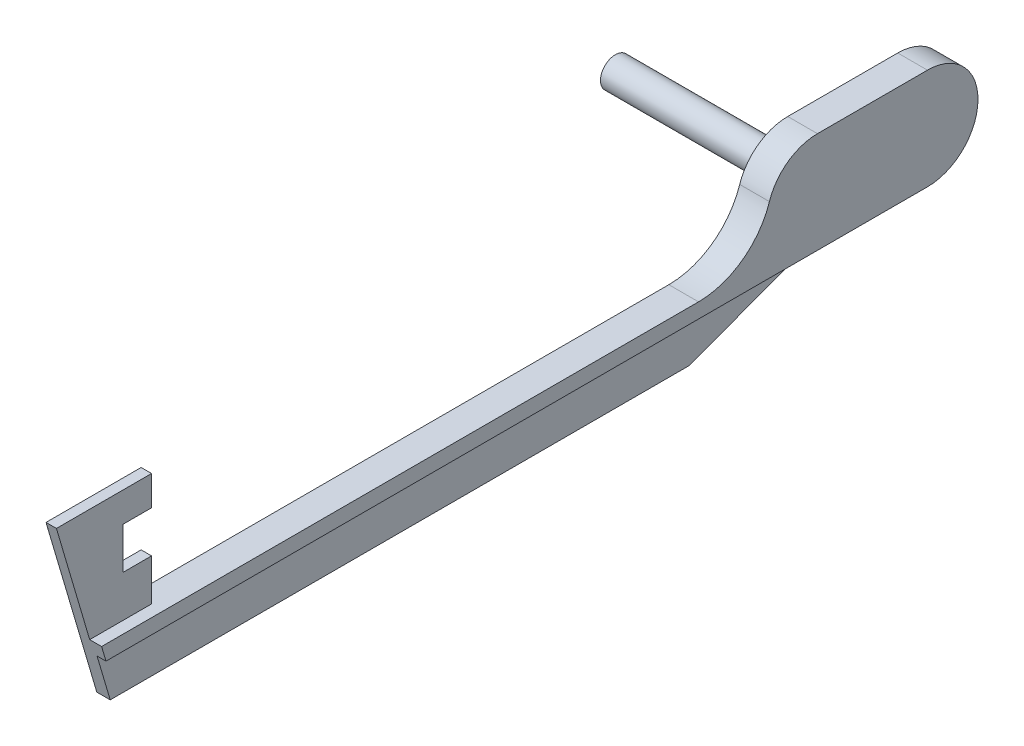
ISO-10303-21;
HEADER;
FILE_DESCRIPTION(('STEP AP214'),'2;1');
FILE_NAME('part.step','',(''),(''),'','','');
FILE_SCHEMA(('AUTOMOTIVE_DESIGN { 1 0 10303 214 1 1 1 1 }'));
ENDSEC;
DATA;
#1=APPLICATION_CONTEXT('core data for automotive mechanical design processes');
#2=APPLICATION_PROTOCOL_DEFINITION('international standard','automotive_design',2000,#1);
#3=PRODUCT_CONTEXT('',#1,'mechanical');
#4=PRODUCT('Part','Part','',(#3));
#5=PRODUCT_RELATED_PRODUCT_CATEGORY('part','',(#4));
#6=PRODUCT_DEFINITION_FORMATION('','',#4);
#7=PRODUCT_DEFINITION_CONTEXT('part definition',#1,'design');
#8=PRODUCT_DEFINITION('design','',#6,#7);
#9=PRODUCT_DEFINITION_SHAPE('','',#8);
#10=(LENGTH_UNIT() NAMED_UNIT(*) SI_UNIT(.MILLI.,.METRE.));
#11=(NAMED_UNIT(*) PLANE_ANGLE_UNIT() SI_UNIT($,.RADIAN.));
#12=(NAMED_UNIT(*) SI_UNIT($,.STERADIAN.) SOLID_ANGLE_UNIT());
#13=UNCERTAINTY_MEASURE_WITH_UNIT(LENGTH_MEASURE(1.E-05),#10,'distance_accuracy_value','');
#14=(GEOMETRIC_REPRESENTATION_CONTEXT(3) GLOBAL_UNCERTAINTY_ASSIGNED_CONTEXT((#13)) GLOBAL_UNIT_ASSIGNED_CONTEXT((#10,
#11,#12)) REPRESENTATION_CONTEXT('',''));
#15=CARTESIAN_POINT('',(0.,0.,0.));
#16=DIRECTION('',(0.,0.,1.));
#17=DIRECTION('',(1.,0.,0.));
#18=AXIS2_PLACEMENT_3D('',#15,#16,#17);
#19=CARTESIAN_POINT('',(2.54,-3.048,0.));
#20=DIRECTION('',(0.,-1.,0.));
#21=DIRECTION('',(0.,0.,-1.));
#22=AXIS2_PLACEMENT_3D('',#19,#20,#21);
#23=PLANE('',#22);
#24=DIRECTION('',(0.,0.,1.));
#25=VECTOR('',#24,1.);
#26=CARTESIAN_POINT('',(0.,-3.048,0.));
#27=LINE('',#26,#25);
#28=CARTESIAN_POINT('',(0.,-3.048,19.558));
#29=VERTEX_POINT('',#28);
#30=CARTESIAN_POINT('',(0.,-3.048,64.6744712471544));
#31=VERTEX_POINT('',#30);
#32=EDGE_CURVE('E269',#29,#31,#27,.T.);
#33=ORIENTED_EDGE('',*,*,#32,.T.);
#34=DIRECTION('',(1.,0.,0.));
#35=VECTOR('',#34,1.);
#36=CARTESIAN_POINT('',(2.54,-3.048,64.6744712471544));
#37=LINE('',#36,#35);
#38=CARTESIAN_POINT('',(0.634140793696349,-3.048,64.6744712471544));
#39=VERTEX_POINT('',#38);
#40=EDGE_CURVE('E209',#31,#39,#37,.T.);
#41=ORIENTED_EDGE('',*,*,#40,.T.);
#42=DIRECTION('',(0.,0.,1.));
#43=VECTOR('',#42,1.);
#44=CARTESIAN_POINT('',(0.634140793696337,-3.048,0.));
#45=LINE('',#44,#43);
#46=CARTESIAN_POINT('',(0.634140793696349,-3.048,65.278));
#47=VERTEX_POINT('',#46);
#48=EDGE_CURVE('E172',#39,#47,#45,.T.);
#49=ORIENTED_EDGE('',*,*,#48,.T.);
#50=DIRECTION('',(1.,0.,0.));
#51=VECTOR('',#50,1.);
#52=CARTESIAN_POINT('',(0.254,-3.048,65.278));
#53=LINE('',#52,#51);
#54=CARTESIAN_POINT('',(1.524,-3.048,65.278));
#55=VERTEX_POINT('',#54);
#56=EDGE_CURVE('E231',#47,#55,#53,.T.);
#57=ORIENTED_EDGE('',*,*,#56,.T.);
#58=DIRECTION('',(0.,0.,1.));
#59=VECTOR('',#58,1.);
#60=CARTESIAN_POINT('',(1.524,-3.048,0.));
#61=LINE('',#60,#59);
#62=CARTESIAN_POINT('',(1.524,-3.048,70.5615860198938));
#63=VERTEX_POINT('',#62);
#64=EDGE_CURVE('E211',#55,#63,#61,.T.);
#65=ORIENTED_EDGE('',*,*,#64,.T.);
#66=DIRECTION('',(-1.,0.,0.));
#67=VECTOR('',#66,1.);
#68=CARTESIAN_POINT('',(2.54,-3.048,70.5615860198938));
#69=LINE('',#68,#67);
#70=CARTESIAN_POINT('',(2.54,-3.048,70.5615860198938));
#71=VERTEX_POINT('',#70);
#72=EDGE_CURVE('E282',#71,#63,#69,.T.);
#73=ORIENTED_EDGE('',*,*,#72,.F.);
#74=DIRECTION('',(0.,0.,1.));
#75=VECTOR('',#74,1.);
#76=CARTESIAN_POINT('',(2.54,-3.048,0.));
#77=LINE('',#76,#75);
#78=CARTESIAN_POINT('',(2.54,-3.048,19.558));
#79=VERTEX_POINT('',#78);
#80=EDGE_CURVE('E280',#79,#71,#77,.T.);
#81=ORIENTED_EDGE('',*,*,#80,.F.);
#82=DIRECTION('',(-1.,0.,0.));
#83=VECTOR('',#82,1.);
#84=CARTESIAN_POINT('',(2.54,-3.048,19.558));
#85=LINE('',#84,#83);
#86=EDGE_CURVE('E297',#79,#29,#85,.T.);
#87=ORIENTED_EDGE('',*,*,#86,.T.);
#88=EDGE_LOOP('',(#33,#41,#49,#57,#65,#73,#81,#87));
#89=FACE_BOUND('',#88,.T.);
#90=ADVANCED_FACE('F35',(#89),#23,.F.);
#91=CARTESIAN_POINT('',(2.54,-19.3762316155653,65.7497076239421));
#92=DIRECTION('',(0.,0.282677628483706,-0.959214969834618));
#93=DIRECTION('',(0.,0.959214969834619,0.282677628483706));
#94=AXIS2_PLACEMENT_3D('',#91,#92,#93);
#95=PLANE('',#94);
#96=DIRECTION('',(1.,0.,0.));
#97=VECTOR('',#96,1.);
#98=CARTESIAN_POINT('',(0.254,6.604,73.406));
#99=LINE('',#98,#97);
#100=CARTESIAN_POINT('',(0.63414079369635,6.604,73.406));
#101=VERTEX_POINT('',#100);
#102=CARTESIAN_POINT('',(1.524,6.604,73.406));
#103=VERTEX_POINT('',#102);
#104=EDGE_CURVE('E232',#101,#103,#99,.T.);
#105=ORIENTED_EDGE('',*,*,#104,.F.);
#106=DIRECTION('',(0.,-0.959214969834619,-0.282677628483706));
#107=VECTOR('',#106,1.);
#108=CARTESIAN_POINT('',(0.634140793696349,-19.3762316155653,65.7497076239421));
#109=LINE('',#108,#107);
#110=CARTESIAN_POINT('',(0.634140793696349,-8.12800000000002,69.0645260303642));
#111=VERTEX_POINT('',#110);
#112=EDGE_CURVE('E207',#101,#111,#109,.T.);
#113=ORIENTED_EDGE('',*,*,#112,.T.);
#114=DIRECTION('',(-1.,0.,0.));
#115=VECTOR('',#114,1.);
#116=CARTESIAN_POINT('',(1.778,-8.128,69.0645260303642));
#117=LINE('',#116,#115);
#118=CARTESIAN_POINT('',(1.778,-8.128,69.0645260303642));
#119=VERTEX_POINT('',#118);
#120=EDGE_CURVE('E189',#119,#111,#117,.T.);
#121=ORIENTED_EDGE('',*,*,#120,.F.);
#122=DIRECTION('',(0.,-0.959214969834618,-0.282677628483706));
#123=VECTOR('',#122,1.);
#124=CARTESIAN_POINT('',(1.778,-19.3762316155653,65.7497076239421));
#125=LINE('',#124,#123);
#126=CARTESIAN_POINT('',(1.778,-4.318,70.1873210225114));
#127=VERTEX_POINT('',#126);
#128=EDGE_CURVE('E252',#127,#119,#125,.T.);
#129=ORIENTED_EDGE('',*,*,#128,.F.);
#130=DIRECTION('',(-1.,0.,0.));
#131=VECTOR('',#130,1.);
#132=CARTESIAN_POINT('',(2.54,-4.318,70.1873210225114));
#133=LINE('',#132,#131);
#134=CARTESIAN_POINT('',(2.54,-4.318,70.1873210225114));
#135=VERTEX_POINT('',#134);
#136=EDGE_CURVE('E43',#135,#127,#133,.T.);
#137=ORIENTED_EDGE('',*,*,#136,.F.);
#138=DIRECTION('',(0.,-0.959214969834618,-0.282677628483706));
#139=VECTOR('',#138,1.);
#140=CARTESIAN_POINT('',(2.54,-19.3762316155653,65.7497076239421));
#141=LINE('',#140,#139);
#142=EDGE_CURVE('E266',#71,#135,#141,.T.);
#143=ORIENTED_EDGE('',*,*,#142,.F.);
#144=ORIENTED_EDGE('',*,*,#72,.T.);
#145=DIRECTION('',(0.,-0.959214969834618,-0.282677628483706));
#146=VECTOR('',#145,1.);
#147=CARTESIAN_POINT('',(1.524,-19.3762316155653,65.7497076239421));
#148=LINE('',#147,#146);
#149=EDGE_CURVE('E57',#103,#63,#148,.T.);
#150=ORIENTED_EDGE('',*,*,#149,.F.);
#151=EDGE_LOOP('',(#105,#113,#121,#129,#137,#143,#144,#150));
#152=FACE_BOUND('',#151,.T.);
#153=ADVANCED_FACE('F37',(#152),#95,.F.);
#154=CARTESIAN_POINT('',(2.54,-4.318,0.));
#155=DIRECTION('',(0.,-1.,0.));
#156=DIRECTION('',(0.,0.,-1.));
#157=AXIS2_PLACEMENT_3D('',#154,#155,#156);
#158=PLANE('',#157);
#159=DIRECTION('',(-1.,0.,0.));
#160=VECTOR('',#159,1.);
#161=CARTESIAN_POINT('',(1.778,-4.318,9.398));
#162=LINE('',#161,#160);
#163=CARTESIAN_POINT('',(1.778,-4.318,9.398));
#164=VERTEX_POINT('',#163);
#165=CARTESIAN_POINT('',(0.,-4.318,9.398));
#166=VERTEX_POINT('',#165);
#167=EDGE_CURVE('E262',#164,#166,#162,.T.);
#168=ORIENTED_EDGE('',*,*,#167,.T.);
#169=DIRECTION('',(0.,0.,1.));
#170=VECTOR('',#169,1.);
#171=CARTESIAN_POINT('',(0.,-4.318,0.));
#172=LINE('',#171,#170);
#173=CARTESIAN_POINT('',(0.,-4.318,0.));
#174=VERTEX_POINT('',#173);
#175=EDGE_CURVE('E265',#174,#166,#172,.T.);
#176=ORIENTED_EDGE('',*,*,#175,.F.);
#177=DIRECTION('',(-1.,0.,0.));
#178=VECTOR('',#177,1.);
#179=CARTESIAN_POINT('',(2.54,-4.318,0.));
#180=LINE('',#179,#178);
#181=CARTESIAN_POINT('',(2.54,-4.318,0.));
#182=VERTEX_POINT('',#181);
#183=EDGE_CURVE('E309',#182,#174,#180,.T.);
#184=ORIENTED_EDGE('',*,*,#183,.F.);
#185=DIRECTION('',(0.,0.,1.));
#186=VECTOR('',#185,1.);
#187=CARTESIAN_POINT('',(2.54,-4.318,0.));
#188=LINE('',#187,#186);
#189=EDGE_CURVE('E268',#182,#135,#188,.T.);
#190=ORIENTED_EDGE('',*,*,#189,.T.);
#191=ORIENTED_EDGE('',*,*,#136,.T.);
#192=DIRECTION('',(0.,0.,1.));
#193=VECTOR('',#192,1.);
#194=CARTESIAN_POINT('',(1.778,-4.318,0.));
#195=LINE('',#194,#193);
#196=EDGE_CURVE('E249',#164,#127,#195,.T.);
#197=ORIENTED_EDGE('',*,*,#196,.F.);
#198=EDGE_LOOP('',(#168,#176,#184,#190,#191,#197));
#199=FACE_BOUND('',#198,.T.);
#200=ADVANCED_FACE('F314',(#199),#158,.T.);
#201=CARTESIAN_POINT('',(2.54,0.,0.));
#202=DIRECTION('',(-1.,0.,0.));
#203=DIRECTION('',(0.,0.,1.));
#204=AXIS2_PLACEMENT_3D('',#201,#202,#203);
#205=CYLINDRICAL_SURFACE('',#204,4.318);
#206=CARTESIAN_POINT('',(0.,0.,0.));
#207=DIRECTION('',(1.,0.,0.));
#208=DIRECTION('',(0.,0.,-1.));
#209=AXIS2_PLACEMENT_3D('',#206,#207,#208);
#210=CIRCLE('',#209,4.318);
#211=CARTESIAN_POINT('',(0.,4.318,0.));
#212=VERTEX_POINT('',#211);
#213=EDGE_CURVE('E285',#174,#212,#210,.T.);
#214=ORIENTED_EDGE('',*,*,#213,.T.);
#215=DIRECTION('',(-1.,0.,0.));
#216=VECTOR('',#215,1.);
#217=CARTESIAN_POINT('',(2.54,4.318,0.));
#218=LINE('',#217,#216);
#219=CARTESIAN_POINT('',(2.54,4.318,0.));
#220=VERTEX_POINT('',#219);
#221=EDGE_CURVE('E306',#220,#212,#218,.T.);
#222=ORIENTED_EDGE('',*,*,#221,.F.);
#223=CARTESIAN_POINT('',(2.54,0.,0.));
#224=DIRECTION('',(1.,0.,0.));
#225=DIRECTION('',(0.,0.,-1.));
#226=AXIS2_PLACEMENT_3D('',#223,#224,#225);
#227=CIRCLE('',#226,4.318);
#228=EDGE_CURVE('E272',#182,#220,#227,.T.);
#229=ORIENTED_EDGE('',*,*,#228,.F.);
#230=ORIENTED_EDGE('',*,*,#183,.T.);
#231=EDGE_LOOP('',(#214,#222,#229,#230));
#232=FACE_BOUND('',#231,.T.);
#233=ADVANCED_FACE('F334',(#232),#205,.T.);
#234=CARTESIAN_POINT('',(2.54,4.318,0.));
#235=DIRECTION('',(0.,-1.,0.));
#236=DIRECTION('',(0.,0.,-1.));
#237=AXIS2_PLACEMENT_3D('',#234,#235,#236);
#238=PLANE('',#237);
#239=DIRECTION('',(0.,0.,1.));
#240=VECTOR('',#239,1.);
#241=CARTESIAN_POINT('',(0.,4.318,0.));
#242=LINE('',#241,#240);
#243=CARTESIAN_POINT('',(0.,4.318,9.398));
#244=VERTEX_POINT('',#243);
#245=EDGE_CURVE('E287',#212,#244,#242,.T.);
#246=ORIENTED_EDGE('',*,*,#245,.T.);
#247=DIRECTION('',(-1.,0.,0.));
#248=VECTOR('',#247,1.);
#249=CARTESIAN_POINT('',(2.54,4.318,9.398));
#250=LINE('',#249,#248);
#251=CARTESIAN_POINT('',(2.54,4.318,9.398));
#252=VERTEX_POINT('',#251);
#253=EDGE_CURVE('E303',#252,#244,#250,.T.);
#254=ORIENTED_EDGE('',*,*,#253,.F.);
#255=DIRECTION('',(0.,0.,1.));
#256=VECTOR('',#255,1.);
#257=CARTESIAN_POINT('',(2.54,4.318,0.));
#258=LINE('',#257,#256);
#259=EDGE_CURVE('E274',#220,#252,#258,.T.);
#260=ORIENTED_EDGE('',*,*,#259,.F.);
#261=ORIENTED_EDGE('',*,*,#221,.T.);
#262=EDGE_LOOP('',(#246,#254,#260,#261));
#263=FACE_BOUND('',#262,.T.);
#264=ADVANCED_FACE('F338',(#263),#238,.F.);
#265=CARTESIAN_POINT('',(2.54,0.,9.398));
#266=DIRECTION('',(-1.,0.,0.));
#267=DIRECTION('',(0.,0.,1.));
#268=AXIS2_PLACEMENT_3D('',#265,#266,#267);
#269=CYLINDRICAL_SURFACE('',#268,4.318);
#270=CARTESIAN_POINT('',(0.,0.,9.398));
#271=DIRECTION('',(1.,0.,0.));
#272=DIRECTION('',(0.,0.,-1.));
#273=AXIS2_PLACEMENT_3D('',#270,#271,#272);
#274=CIRCLE('',#273,4.318);
#275=CARTESIAN_POINT('',(0.,1.34263088897993,13.5019573945104));
#276=VERTEX_POINT('',#275);
#277=EDGE_CURVE('E289',#244,#276,#274,.T.);
#278=ORIENTED_EDGE('',*,*,#277,.T.);
#279=DIRECTION('',(-1.,0.,0.));
#280=VECTOR('',#279,1.);
#281=CARTESIAN_POINT('',(2.54,1.34263088897993,13.5019573945104));
#282=LINE('',#281,#280);
#283=CARTESIAN_POINT('',(2.54,1.34263088897993,13.5019573945104));
#284=VERTEX_POINT('',#283);
#285=EDGE_CURVE('E300',#284,#276,#282,.T.);
#286=ORIENTED_EDGE('',*,*,#285,.F.);
#287=CARTESIAN_POINT('',(2.54,0.,9.398));
#288=DIRECTION('',(1.,0.,0.));
#289=DIRECTION('',(0.,0.,-1.));
#290=AXIS2_PLACEMENT_3D('',#287,#288,#289);
#291=CIRCLE('',#290,4.318);
#292=EDGE_CURVE('E276',#252,#284,#291,.T.);
#293=ORIENTED_EDGE('',*,*,#292,.F.);
#294=ORIENTED_EDGE('',*,*,#253,.T.);
#295=EDGE_LOOP('',(#278,#286,#293,#294));
#296=FACE_BOUND('',#295,.T.);
#297=ADVANCED_FACE('F383',(#296),#269,.T.);
#298=CARTESIAN_POINT('',(2.54,3.32389655172413,19.558));
#299=DIRECTION('',(-1.,0.,0.));
#300=DIRECTION('',(0.,0.,1.));
#301=AXIS2_PLACEMENT_3D('',#298,#299,#300);
#302=CYLINDRICAL_SURFACE('',#301,6.37189655172413);
#303=CARTESIAN_POINT('',(0.,3.32389655172413,19.558));
#304=DIRECTION('',(1.,0.,0.));
#305=DIRECTION('',(0.,0.,-1.));
#306=AXIS2_PLACEMENT_3D('',#303,#304,#305);
#307=CIRCLE('',#306,6.37189655172413);
#308=EDGE_CURVE('E291',#276,#29,#307,.F.);
#309=ORIENTED_EDGE('',*,*,#308,.T.);
#310=ORIENTED_EDGE('',*,*,#86,.F.);
#311=CARTESIAN_POINT('',(2.54,3.32389655172413,19.558));
#312=DIRECTION('',(1.,0.,0.));
#313=DIRECTION('',(0.,0.,-1.));
#314=AXIS2_PLACEMENT_3D('',#311,#312,#313);
#315=CIRCLE('',#314,6.37189655172413);
#316=EDGE_CURVE('E278',#284,#79,#315,.F.);
#317=ORIENTED_EDGE('',*,*,#316,.F.);
#318=ORIENTED_EDGE('',*,*,#285,.T.);
#319=EDGE_LOOP('',(#309,#310,#317,#318));
#320=FACE_BOUND('',#319,.T.);
#321=ADVANCED_FACE('F381',(#320),#302,.F.);
#322=CARTESIAN_POINT('',(2.54,0.,0.));
#323=DIRECTION('',(1.,0.,0.));
#324=DIRECTION('',(0.,0.,-1.));
#325=AXIS2_PLACEMENT_3D('',#322,#323,#324);
#326=PLANE('',#325);
#327=ORIENTED_EDGE('',*,*,#142,.T.);
#328=ORIENTED_EDGE('',*,*,#189,.F.);
#329=ORIENTED_EDGE('',*,*,#228,.T.);
#330=ORIENTED_EDGE('',*,*,#259,.T.);
#331=ORIENTED_EDGE('',*,*,#292,.T.);
#332=ORIENTED_EDGE('',*,*,#316,.T.);
#333=ORIENTED_EDGE('',*,*,#80,.T.);
#334=EDGE_LOOP('',(#327,#328,#329,#330,#331,#332,#333));
#335=FACE_BOUND('',#334,.T.);
#336=ADVANCED_FACE('F342',(#335),#326,.T.);
#337=CARTESIAN_POINT('',(0.,0.,0.));
#338=DIRECTION('',(1.,0.,0.));
#339=DIRECTION('',(0.,0.,-1.));
#340=AXIS2_PLACEMENT_3D('',#337,#338,#339);
#341=PLANE('',#340);
#342=CARTESIAN_POINT('',(0.,0.,9.144));
#343=DIRECTION('',(1.,0.,0.));
#344=DIRECTION('',(0.,0.,-1.));
#345=AXIS2_PLACEMENT_3D('',#342,#343,#344);
#346=CIRCLE('',#345,1.27);
#347=CARTESIAN_POINT('',(0.,0.,7.874));
#348=VERTEX_POINT('',#347);
#349=EDGE_CURVE('E195',#348,#348,#346,.T.);
#350=ORIENTED_EDGE('',*,*,#349,.T.);
#351=EDGE_LOOP('',(#350));
#352=FACE_BOUND('',#351,.T.);
#353=DIRECTION('',(0.,0.,1.));
#354=VECTOR('',#353,1.);
#355=CARTESIAN_POINT('',(0.,-8.128,0.));
#356=LINE('',#355,#354);
#357=CARTESIAN_POINT('',(0.,-8.128,19.558));
#358=VERTEX_POINT('',#357);
#359=CARTESIAN_POINT('',(0.,-8.12800000000002,64.6744712471544));
#360=VERTEX_POINT('',#359);
#361=EDGE_CURVE('E250',#358,#360,#356,.T.);
#362=ORIENTED_EDGE('',*,*,#361,.T.);
#363=DIRECTION('',(0.,1.,0.));
#364=VECTOR('',#363,1.);
#365=CARTESIAN_POINT('',(0.,-8.12800000000002,64.6744712471544));
#366=LINE('',#365,#364);
#367=EDGE_CURVE('E175',#360,#31,#366,.T.);
#368=ORIENTED_EDGE('',*,*,#367,.T.);
#369=ORIENTED_EDGE('',*,*,#32,.F.);
#370=ORIENTED_EDGE('',*,*,#308,.F.);
#371=ORIENTED_EDGE('',*,*,#277,.F.);
#372=ORIENTED_EDGE('',*,*,#245,.F.);
#373=ORIENTED_EDGE('',*,*,#213,.F.);
#374=ORIENTED_EDGE('',*,*,#175,.T.);
#375=DIRECTION('',(0.,-0.351123441588392,0.936329177569045));
#376=VECTOR('',#375,1.);
#377=CARTESIAN_POINT('',(0.,-0.695890410958908,-0.26095890410959));
#378=LINE('',#377,#376);
#379=EDGE_CURVE('E234',#166,#358,#378,.T.);
#380=ORIENTED_EDGE('',*,*,#379,.T.);
#381=EDGE_LOOP('',(#362,#368,#369,#370,#371,#372,#373,#374,#380));
#382=FACE_BOUND('',#381,.T.);
#383=ADVANCED_FACE('F329',(#352,#382),#341,.F.);
#384=CARTESIAN_POINT('',(1.778,-0.695890410958908,-0.26095890410959));
#385=DIRECTION('',(0.,-0.936329177569045,-0.351123441588392));
#386=DIRECTION('',(0.,0.351123441588392,-0.936329177569045));
#387=AXIS2_PLACEMENT_3D('',#384,#385,#386);
#388=PLANE('',#387);
#389=ORIENTED_EDGE('',*,*,#379,.F.);
#390=ORIENTED_EDGE('',*,*,#167,.F.);
#391=DIRECTION('',(0.,-0.351123441588392,0.936329177569045));
#392=VECTOR('',#391,1.);
#393=CARTESIAN_POINT('',(1.778,-0.695890410958908,-0.26095890410959));
#394=LINE('',#393,#392);
#395=CARTESIAN_POINT('',(1.778,-8.128,19.558));
#396=VERTEX_POINT('',#395);
#397=EDGE_CURVE('E246',#164,#396,#394,.T.);
#398=ORIENTED_EDGE('',*,*,#397,.T.);
#399=DIRECTION('',(-1.,0.,0.));
#400=VECTOR('',#399,1.);
#401=CARTESIAN_POINT('',(1.778,-8.128,19.558));
#402=LINE('',#401,#400);
#403=EDGE_CURVE('E256',#396,#358,#402,.T.);
#404=ORIENTED_EDGE('',*,*,#403,.T.);
#405=EDGE_LOOP('',(#389,#390,#398,#404));
#406=FACE_BOUND('',#405,.T.);
#407=ADVANCED_FACE('F325',(#406),#388,.T.);
#408=CARTESIAN_POINT('',(1.778,-8.128,0.));
#409=DIRECTION('',(0.,-1.,0.));
#410=DIRECTION('',(0.,0.,-1.));
#411=AXIS2_PLACEMENT_3D('',#408,#409,#410);
#412=PLANE('',#411);
#413=DIRECTION('',(-1.,0.,0.));
#414=VECTOR('',#413,1.);
#415=CARTESIAN_POINT('',(0.,-8.12800000000002,64.6744712471544));
#416=LINE('',#415,#414);
#417=CARTESIAN_POINT('',(0.634140793696349,-8.12800000000002,64.6744712471544));
#418=VERTEX_POINT('',#417);
#419=EDGE_CURVE('E176',#418,#360,#416,.T.);
#420=ORIENTED_EDGE('',*,*,#419,.T.);
#421=ORIENTED_EDGE('',*,*,#361,.F.);
#422=ORIENTED_EDGE('',*,*,#403,.F.);
#423=DIRECTION('',(0.,0.,1.));
#424=VECTOR('',#423,1.);
#425=CARTESIAN_POINT('',(1.778,-8.128,0.));
#426=LINE('',#425,#424);
#427=EDGE_CURVE('E254',#396,#119,#426,.T.);
#428=ORIENTED_EDGE('',*,*,#427,.T.);
#429=ORIENTED_EDGE('',*,*,#120,.T.);
#430=DIRECTION('',(0.,0.,-1.));
#431=VECTOR('',#430,1.);
#432=CARTESIAN_POINT('',(0.63414079369635,-8.12800000000002,73.406));
#433=LINE('',#432,#431);
#434=EDGE_CURVE('E169',#111,#418,#433,.T.);
#435=ORIENTED_EDGE('',*,*,#434,.T.);
#436=EDGE_LOOP('',(#420,#421,#422,#428,#429,#435));
#437=FACE_BOUND('',#436,.T.);
#438=ADVANCED_FACE('F186',(#437),#412,.T.);
#439=CARTESIAN_POINT('',(1.778,0.,0.));
#440=DIRECTION('',(1.,0.,0.));
#441=DIRECTION('',(0.,0.,-1.));
#442=AXIS2_PLACEMENT_3D('',#439,#440,#441);
#443=PLANE('',#442);
#444=ORIENTED_EDGE('',*,*,#397,.F.);
#445=ORIENTED_EDGE('',*,*,#196,.T.);
#446=ORIENTED_EDGE('',*,*,#128,.T.);
#447=ORIENTED_EDGE('',*,*,#427,.F.);
#448=EDGE_LOOP('',(#444,#445,#446,#447));
#449=FACE_BOUND('',#448,.T.);
#450=ADVANCED_FACE('F323',(#449),#443,.T.);
#451=CARTESIAN_POINT('',(0.254,6.60400000000001,0.));
#452=DIRECTION('',(0.,1.,0.));
#453=DIRECTION('',(0.,0.,1.));
#454=AXIS2_PLACEMENT_3D('',#451,#452,#453);
#455=PLANE('',#454);
#456=DIRECTION('',(0.,0.,-1.));
#457=VECTOR('',#456,1.);
#458=CARTESIAN_POINT('',(0.63414079369635,6.604,73.406));
#459=LINE('',#458,#457);
#460=CARTESIAN_POINT('',(0.634140793696349,6.604,65.278));
#461=VERTEX_POINT('',#460);
#462=EDGE_CURVE('E190',#101,#461,#459,.T.);
#463=ORIENTED_EDGE('',*,*,#462,.F.);
#464=ORIENTED_EDGE('',*,*,#104,.T.);
#465=DIRECTION('',(0.,0.,1.));
#466=VECTOR('',#465,1.);
#467=CARTESIAN_POINT('',(1.524,6.60400000000001,0.));
#468=LINE('',#467,#466);
#469=CARTESIAN_POINT('',(1.524,6.604,65.278));
#470=VERTEX_POINT('',#469);
#471=EDGE_CURVE('E228',#470,#103,#468,.T.);
#472=ORIENTED_EDGE('',*,*,#471,.F.);
#473=DIRECTION('',(1.,0.,0.));
#474=VECTOR('',#473,1.);
#475=CARTESIAN_POINT('',(0.254,6.604,65.278));
#476=LINE('',#475,#474);
#477=EDGE_CURVE('E235',#461,#470,#476,.T.);
#478=ORIENTED_EDGE('',*,*,#477,.F.);
#479=EDGE_LOOP('',(#463,#464,#472,#478));
#480=FACE_BOUND('',#479,.T.);
#481=ADVANCED_FACE('F352',(#480),#455,.T.);
#482=CARTESIAN_POINT('',(0.254,0.,65.278));
#483=DIRECTION('',(0.,0.,-1.));
#484=DIRECTION('',(-1.,0.,0.));
#485=AXIS2_PLACEMENT_3D('',#482,#483,#484);
#486=PLANE('',#485);
#487=DIRECTION('',(0.,-1.,0.));
#488=VECTOR('',#487,1.);
#489=CARTESIAN_POINT('',(0.634140793696349,0.,65.278));
#490=LINE('',#489,#488);
#491=CARTESIAN_POINT('',(0.634140793696349,4.064,65.278));
#492=VERTEX_POINT('',#491);
#493=EDGE_CURVE('E204',#461,#492,#490,.T.);
#494=ORIENTED_EDGE('',*,*,#493,.F.);
#495=ORIENTED_EDGE('',*,*,#477,.T.);
#496=DIRECTION('',(0.,1.,0.));
#497=VECTOR('',#496,1.);
#498=CARTESIAN_POINT('',(1.524,0.,65.278));
#499=LINE('',#498,#497);
#500=CARTESIAN_POINT('',(1.524,4.064,65.278));
#501=VERTEX_POINT('',#500);
#502=EDGE_CURVE('E225',#501,#470,#499,.T.);
#503=ORIENTED_EDGE('',*,*,#502,.F.);
#504=DIRECTION('',(1.,0.,0.));
#505=VECTOR('',#504,1.);
#506=CARTESIAN_POINT('',(0.254,4.064,65.278));
#507=LINE('',#506,#505);
#508=EDGE_CURVE('E237',#492,#501,#507,.T.);
#509=ORIENTED_EDGE('',*,*,#508,.F.);
#510=EDGE_LOOP('',(#494,#495,#503,#509));
#511=FACE_BOUND('',#510,.T.);
#512=ADVANCED_FACE('F360',(#511),#486,.T.);
#513=CARTESIAN_POINT('',(0.254,4.064,0.));
#514=DIRECTION('',(0.,-1.,0.));
#515=DIRECTION('',(0.,0.,-1.));
#516=AXIS2_PLACEMENT_3D('',#513,#514,#515);
#517=PLANE('',#516);
#518=DIRECTION('',(0.,0.,1.));
#519=VECTOR('',#518,1.);
#520=CARTESIAN_POINT('',(0.634140793696337,4.064,0.));
#521=LINE('',#520,#519);
#522=CARTESIAN_POINT('',(0.634140793696349,4.064,67.7085020070529));
#523=VERTEX_POINT('',#522);
#524=EDGE_CURVE('E202',#492,#523,#521,.T.);
#525=ORIENTED_EDGE('',*,*,#524,.F.);
#526=ORIENTED_EDGE('',*,*,#508,.T.);
#527=DIRECTION('',(0.,0.,-1.));
#528=VECTOR('',#527,1.);
#529=CARTESIAN_POINT('',(1.524,4.064,0.));
#530=LINE('',#529,#528);
#531=CARTESIAN_POINT('',(1.524,4.064,67.7085020070529));
#532=VERTEX_POINT('',#531);
#533=EDGE_CURVE('E222',#532,#501,#530,.T.);
#534=ORIENTED_EDGE('',*,*,#533,.F.);
#535=DIRECTION('',(1.,0.,0.));
#536=VECTOR('',#535,1.);
#537=CARTESIAN_POINT('',(0.254,4.064,67.7085020070529));
#538=LINE('',#537,#536);
#539=EDGE_CURVE('E239',#523,#532,#538,.T.);
#540=ORIENTED_EDGE('',*,*,#539,.F.);
#541=EDGE_LOOP('',(#525,#526,#534,#540));
#542=FACE_BOUND('',#541,.T.);
#543=ADVANCED_FACE('F365',(#542),#517,.T.);
#544=CARTESIAN_POINT('',(0.254,0.,67.7085020070529));
#545=DIRECTION('',(0.,0.,-1.));
#546=DIRECTION('',(-1.,0.,0.));
#547=AXIS2_PLACEMENT_3D('',#544,#545,#546);
#548=PLANE('',#547);
#549=DIRECTION('',(0.,-1.,0.));
#550=VECTOR('',#549,1.);
#551=CARTESIAN_POINT('',(0.634140793696349,0.,67.7085020070529));
#552=LINE('',#551,#550);
#553=CARTESIAN_POINT('',(0.634140793696349,0.508,67.7085020070529));
#554=VERTEX_POINT('',#553);
#555=EDGE_CURVE('E200',#523,#554,#552,.T.);
#556=ORIENTED_EDGE('',*,*,#555,.F.);
#557=ORIENTED_EDGE('',*,*,#539,.T.);
#558=DIRECTION('',(0.,1.,0.));
#559=VECTOR('',#558,1.);
#560=CARTESIAN_POINT('',(1.524,0.,67.7085020070529));
#561=LINE('',#560,#559);
#562=CARTESIAN_POINT('',(1.524,0.508,67.7085020070529));
#563=VERTEX_POINT('',#562);
#564=EDGE_CURVE('E219',#563,#532,#561,.T.);
#565=ORIENTED_EDGE('',*,*,#564,.F.);
#566=DIRECTION('',(1.,0.,0.));
#567=VECTOR('',#566,1.);
#568=CARTESIAN_POINT('',(0.254,0.508,67.7085020070529));
#569=LINE('',#568,#567);
#570=EDGE_CURVE('E241',#554,#563,#569,.T.);
#571=ORIENTED_EDGE('',*,*,#570,.F.);
#572=EDGE_LOOP('',(#556,#557,#565,#571));
#573=FACE_BOUND('',#572,.T.);
#574=ADVANCED_FACE('F368',(#573),#548,.T.);
#575=CARTESIAN_POINT('',(0.254,0.50800000000001,0.));
#576=DIRECTION('',(0.,1.,0.));
#577=DIRECTION('',(0.,0.,1.));
#578=AXIS2_PLACEMENT_3D('',#575,#576,#577);
#579=PLANE('',#578);
#580=DIRECTION('',(0.,0.,-1.));
#581=VECTOR('',#580,1.);
#582=CARTESIAN_POINT('',(0.634140793696337,0.50800000000001,0.));
#583=LINE('',#582,#581);
#584=CARTESIAN_POINT('',(0.634140793696349,0.508000000000001,65.278));
#585=VERTEX_POINT('',#584);
#586=EDGE_CURVE('E49',#554,#585,#583,.T.);
#587=ORIENTED_EDGE('',*,*,#586,.F.);
#588=ORIENTED_EDGE('',*,*,#570,.T.);
#589=DIRECTION('',(0.,0.,1.));
#590=VECTOR('',#589,1.);
#591=CARTESIAN_POINT('',(1.524,0.50800000000001,0.));
#592=LINE('',#591,#590);
#593=CARTESIAN_POINT('',(1.524,0.508000000000001,65.278));
#594=VERTEX_POINT('',#593);
#595=EDGE_CURVE('E216',#594,#563,#592,.T.);
#596=ORIENTED_EDGE('',*,*,#595,.F.);
#597=DIRECTION('',(1.,0.,0.));
#598=VECTOR('',#597,1.);
#599=CARTESIAN_POINT('',(0.254,0.508000000000001,65.278));
#600=LINE('',#599,#598);
#601=EDGE_CURVE('E243',#585,#594,#600,.T.);
#602=ORIENTED_EDGE('',*,*,#601,.F.);
#603=EDGE_LOOP('',(#587,#588,#596,#602));
#604=FACE_BOUND('',#603,.T.);
#605=ADVANCED_FACE('F372',(#604),#579,.T.);
#606=CARTESIAN_POINT('',(0.254,0.,65.278));
#607=DIRECTION('',(0.,0.,-1.));
#608=DIRECTION('',(-1.,0.,0.));
#609=AXIS2_PLACEMENT_3D('',#606,#607,#608);
#610=PLANE('',#609);
#611=DIRECTION('',(0.,-1.,0.));
#612=VECTOR('',#611,1.);
#613=CARTESIAN_POINT('',(0.634140793696349,0.,65.278));
#614=LINE('',#613,#612);
#615=EDGE_CURVE('E11',#585,#47,#614,.T.);
#616=ORIENTED_EDGE('',*,*,#615,.F.);
#617=ORIENTED_EDGE('',*,*,#601,.T.);
#618=DIRECTION('',(0.,1.,0.));
#619=VECTOR('',#618,1.);
#620=CARTESIAN_POINT('',(1.524,0.,65.278));
#621=LINE('',#620,#619);
#622=EDGE_CURVE('E213',#55,#594,#621,.T.);
#623=ORIENTED_EDGE('',*,*,#622,.F.);
#624=ORIENTED_EDGE('',*,*,#56,.F.);
#625=EDGE_LOOP('',(#616,#617,#623,#624));
#626=FACE_BOUND('',#625,.T.);
#627=ADVANCED_FACE('F376',(#626),#610,.T.);
#628=CARTESIAN_POINT('',(1.524,0.,0.));
#629=DIRECTION('',(1.,0.,0.));
#630=DIRECTION('',(0.,0.,-1.));
#631=AXIS2_PLACEMENT_3D('',#628,#629,#630);
#632=PLANE('',#631);
#633=ORIENTED_EDGE('',*,*,#64,.F.);
#634=ORIENTED_EDGE('',*,*,#622,.T.);
#635=ORIENTED_EDGE('',*,*,#595,.T.);
#636=ORIENTED_EDGE('',*,*,#564,.T.);
#637=ORIENTED_EDGE('',*,*,#533,.T.);
#638=ORIENTED_EDGE('',*,*,#502,.T.);
#639=ORIENTED_EDGE('',*,*,#471,.T.);
#640=ORIENTED_EDGE('',*,*,#149,.T.);
#641=EDGE_LOOP('',(#633,#634,#635,#636,#637,#638,#639,#640));
#642=FACE_BOUND('',#641,.T.);
#643=ADVANCED_FACE('F354',(#642),#632,.T.);
#644=CARTESIAN_POINT('',(0.,-8.12800000000002,64.6744712471544));
#645=DIRECTION('',(0.,0.,-1.));
#646=DIRECTION('',(0.,1.,0.));
#647=AXIS2_PLACEMENT_3D('',#644,#645,#646);
#648=PLANE('',#647);
#649=ORIENTED_EDGE('',*,*,#367,.F.);
#650=ORIENTED_EDGE('',*,*,#419,.F.);
#651=DIRECTION('',(0.,1.,0.));
#652=VECTOR('',#651,1.);
#653=CARTESIAN_POINT('',(0.634140793696349,-8.12800000000002,64.6744712471544));
#654=LINE('',#653,#652);
#655=EDGE_CURVE('E165',#418,#39,#654,.T.);
#656=ORIENTED_EDGE('',*,*,#655,.T.);
#657=ORIENTED_EDGE('',*,*,#40,.F.);
#658=EDGE_LOOP('',(#649,#650,#656,#657));
#659=FACE_BOUND('',#658,.T.);
#660=ADVANCED_FACE('F179',(#659),#648,.F.);
#661=CARTESIAN_POINT('',(0.63414079369635,-8.12800000000002,73.406));
#662=DIRECTION('',(1.,0.,0.));
#663=DIRECTION('',(0.,0.,-1.));
#664=AXIS2_PLACEMENT_3D('',#661,#662,#663);
#665=PLANE('',#664);
#666=ORIENTED_EDGE('',*,*,#462,.T.);
#667=ORIENTED_EDGE('',*,*,#493,.T.);
#668=ORIENTED_EDGE('',*,*,#524,.T.);
#669=ORIENTED_EDGE('',*,*,#555,.T.);
#670=ORIENTED_EDGE('',*,*,#586,.T.);
#671=ORIENTED_EDGE('',*,*,#615,.T.);
#672=ORIENTED_EDGE('',*,*,#48,.F.);
#673=ORIENTED_EDGE('',*,*,#655,.F.);
#674=ORIENTED_EDGE('',*,*,#434,.F.);
#675=ORIENTED_EDGE('',*,*,#112,.F.);
#676=EDGE_LOOP('',(#666,#667,#668,#669,#670,#671,#672,#673,#674,#675));
#677=FACE_BOUND('',#676,.T.);
#678=ADVANCED_FACE('F167',(#677),#665,.F.);
#679=CARTESIAN_POINT('',(-14.986,0.,9.144));
#680=DIRECTION('',(1.,0.,0.));
#681=DIRECTION('',(0.,0.,-1.));
#682=AXIS2_PLACEMENT_3D('',#679,#680,#681);
#683=CYLINDRICAL_SURFACE('',#682,1.27);
#684=CARTESIAN_POINT('',(-14.986,0.,9.144));
#685=DIRECTION('',(1.,0.,0.));
#686=DIRECTION('',(0.,0.,-1.));
#687=AXIS2_PLACEMENT_3D('',#684,#685,#686);
#688=CIRCLE('',#687,1.27);
#689=CARTESIAN_POINT('',(-14.986,0.,7.874));
#690=VERTEX_POINT('',#689);
#691=EDGE_CURVE('E192',#690,#690,#688,.T.);
#692=ORIENTED_EDGE('',*,*,#691,.T.);
#693=EDGE_LOOP('',(#692));
#694=FACE_BOUND('',#693,.T.);
#695=ORIENTED_EDGE('',*,*,#349,.F.);
#696=EDGE_LOOP('',(#695));
#697=FACE_BOUND('',#696,.T.);
#698=ADVANCED_FACE('F425',(#694,#697),#683,.T.);
#699=CARTESIAN_POINT('',(-14.986,0.,0.));
#700=DIRECTION('',(1.,0.,0.));
#701=DIRECTION('',(0.,0.,-1.));
#702=AXIS2_PLACEMENT_3D('',#699,#700,#701);
#703=PLANE('',#702);
#704=ORIENTED_EDGE('',*,*,#691,.F.);
#705=EDGE_LOOP('',(#704));
#706=FACE_BOUND('',#705,.T.);
#707=ADVANCED_FACE('F430',(#706),#703,.F.);
#708=CLOSED_SHELL('',(#90,#153,#200,#233,#264,#297,#321,#336,#383,#407,#438,#450,#481,#512,#543,
#574,#605,#627,#643,#660,#678,#698,#707));
#709=MANIFOLD_SOLID_BREP('B2',#708);
#710=ADVANCED_BREP_SHAPE_REPRESENTATION('',(#18,#709),#14);
#711=SHAPE_DEFINITION_REPRESENTATION(#9,#710);
ENDSEC;
END-ISO-10303-21;
